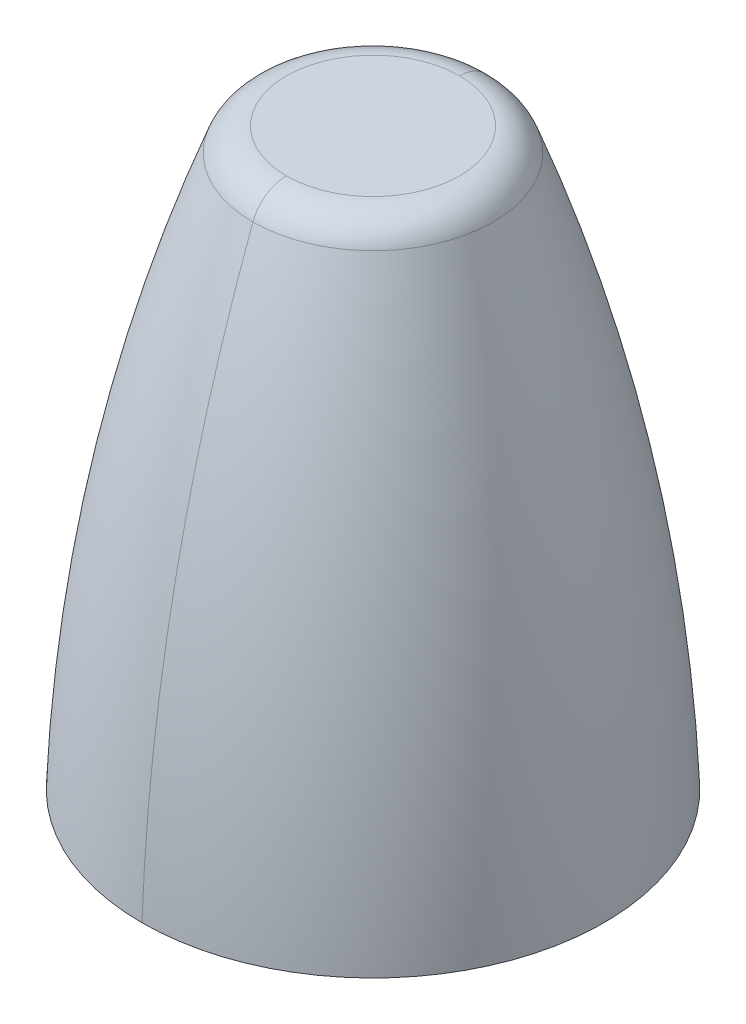
ISO-10303-21;
HEADER;
FILE_DESCRIPTION(('STEP AP214'),'2;1');
FILE_NAME('part.step','',(''),(''),'','','');
FILE_SCHEMA(('AUTOMOTIVE_DESIGN { 1 0 10303 214 1 1 1 1 }'));
ENDSEC;
DATA;
#1=APPLICATION_CONTEXT('core data for automotive mechanical design processes');
#2=APPLICATION_PROTOCOL_DEFINITION('international standard','automotive_design',2000,#1);
#3=PRODUCT_CONTEXT('',#1,'mechanical');
#4=PRODUCT('Part','Part','',(#3));
#5=PRODUCT_RELATED_PRODUCT_CATEGORY('part','',(#4));
#6=PRODUCT_DEFINITION_FORMATION('','',#4);
#7=PRODUCT_DEFINITION_CONTEXT('part definition',#1,'design');
#8=PRODUCT_DEFINITION('design','',#6,#7);
#9=PRODUCT_DEFINITION_SHAPE('','',#8);
#10=(LENGTH_UNIT() NAMED_UNIT(*) SI_UNIT(.MILLI.,.METRE.));
#11=(NAMED_UNIT(*) PLANE_ANGLE_UNIT() SI_UNIT($,.RADIAN.));
#12=(NAMED_UNIT(*) SI_UNIT($,.STERADIAN.) SOLID_ANGLE_UNIT());
#13=UNCERTAINTY_MEASURE_WITH_UNIT(LENGTH_MEASURE(1.E-05),#10,'distance_accuracy_value','');
#14=(GEOMETRIC_REPRESENTATION_CONTEXT(3) GLOBAL_UNCERTAINTY_ASSIGNED_CONTEXT((#13)) GLOBAL_UNIT_ASSIGNED_CONTEXT((#10,
#11,#12)) REPRESENTATION_CONTEXT('',''));
#15=CARTESIAN_POINT('',(0.,0.,0.));
#16=DIRECTION('',(0.,0.,1.));
#17=DIRECTION('',(1.,0.,0.));
#18=AXIS2_PLACEMENT_3D('',#15,#16,#17);
#19=CARTESIAN_POINT('',(0.,5.39961118561913,0.));
#20=DIRECTION('',(0.,-1.,0.));
#21=DIRECTION('',(0.,0.,-1.));
#22=AXIS2_PLACEMENT_3D('',#19,#20,#21);
#23=TOROIDAL_SURFACE('',#22,8.69,2.54);
#24=CARTESIAN_POINT('',(0.,2.85961118561913,0.));
#25=DIRECTION('',(0.,1.,0.));
#26=DIRECTION('',(0.,0.,-1.));
#27=AXIS2_PLACEMENT_3D('',#24,#25,#26);
#28=CIRCLE('',#27,8.69);
#29=CARTESIAN_POINT('',(0.,2.85961118561913,8.69));
#30=VERTEX_POINT('',#29);
#31=CARTESIAN_POINT('',(0.,2.85961118561913,-8.69));
#32=VERTEX_POINT('',#31);
#33=EDGE_CURVE('E40',#30,#32,#28,.T.);
#34=ORIENTED_EDGE('',*,*,#33,.F.);
#35=CARTESIAN_POINT('',(0.,5.39961118561913,8.69));
#36=DIRECTION('',(1.,0.,0.));
#37=DIRECTION('',(0.,0.,-1.));
#38=AXIS2_PLACEMENT_3D('',#35,#36,#37);
#39=CIRCLE('',#38,2.54);
#40=CARTESIAN_POINT('',(0.,5.39961118561913,6.15));
#41=VERTEX_POINT('',#40);
#42=EDGE_CURVE('E10',#30,#41,#39,.T.);
#43=ORIENTED_EDGE('',*,*,#42,.T.);
#44=CARTESIAN_POINT('',(0.,5.39961118561913,0.));
#45=DIRECTION('',(0.,-1.,0.));
#46=DIRECTION('',(0.,0.,-1.));
#47=AXIS2_PLACEMENT_3D('',#44,#45,#46);
#48=CIRCLE('',#47,6.15);
#49=CARTESIAN_POINT('',(0.,5.39961118561913,-6.15));
#50=VERTEX_POINT('',#49);
#51=EDGE_CURVE('E267',#50,#41,#48,.T.);
#52=ORIENTED_EDGE('',*,*,#51,.F.);
#53=CARTESIAN_POINT('',(0.,5.39961118561913,-8.69));
#54=DIRECTION('',(-1.,0.,0.));
#55=DIRECTION('',(0.,0.,1.));
#56=AXIS2_PLACEMENT_3D('',#53,#54,#55);
#57=CIRCLE('',#56,2.54);
#58=EDGE_CURVE('E171',#32,#50,#57,.T.);
#59=ORIENTED_EDGE('',*,*,#58,.F.);
#60=EDGE_LOOP('',(#34,#43,#52,#59));
#61=FACE_BOUND('',#60,.T.);
#62=ADVANCED_FACE('F15',(#61),#23,.T.);
#63=CARTESIAN_POINT('',(0.,31.4346111856192,0.));
#64=DIRECTION('',(0.,-1.,0.));
#65=DIRECTION('',(0.,0.,-1.));
#66=AXIS2_PLACEMENT_3D('',#63,#64,#65);
#67=CONICAL_SURFACE('',#66,5.1308,0.259607300018462);
#68=CARTESIAN_POINT('',(0.,31.4346111856192,0.));
#69=DIRECTION('',(0.,-1.,0.));
#70=DIRECTION('',(0.,0.,-1.));
#71=AXIS2_PLACEMENT_3D('',#68,#69,#70);
#72=CIRCLE('',#71,5.1308);
#73=CARTESIAN_POINT('',(0.,31.4346111856192,5.1308));
#74=VERTEX_POINT('',#73);
#75=CARTESIAN_POINT('',(0.,31.4346111856192,-5.1308));
#76=VERTEX_POINT('',#75);
#77=EDGE_CURVE('E162',#74,#76,#72,.T.);
#78=ORIENTED_EDGE('',*,*,#77,.F.);
#79=DIRECTION('',(0.,-0.966490859144819,0.25670103075272));
#80=VECTOR('',#79,1.);
#81=CARTESIAN_POINT('',(0.,31.4346111856192,5.1308));
#82=LINE('',#81,#80);
#83=CARTESIAN_POINT('',(0.,25.4097866328368,6.731));
#84=VERTEX_POINT('',#83);
#85=EDGE_CURVE('E26',#74,#84,#82,.T.);
#86=ORIENTED_EDGE('',*,*,#85,.T.);
#87=CARTESIAN_POINT('',(0.,25.4097866328368,0.));
#88=DIRECTION('',(0.,-1.,0.));
#89=DIRECTION('',(0.,0.,-1.));
#90=AXIS2_PLACEMENT_3D('',#87,#88,#89);
#91=CIRCLE('',#90,6.731);
#92=CARTESIAN_POINT('',(0.,25.4097866328368,-6.731));
#93=VERTEX_POINT('',#92);
#94=EDGE_CURVE('E151',#84,#93,#91,.T.);
#95=ORIENTED_EDGE('',*,*,#94,.T.);
#96=DIRECTION('',(0.,-0.966490859144819,-0.25670103075272));
#97=VECTOR('',#96,1.);
#98=CARTESIAN_POINT('',(0.,31.4346111856192,-5.1308));
#99=LINE('',#98,#97);
#100=EDGE_CURVE('E169',#76,#93,#99,.T.);
#101=ORIENTED_EDGE('',*,*,#100,.F.);
#102=EDGE_LOOP('',(#78,#86,#95,#101));
#103=FACE_BOUND('',#102,.T.);
#104=ADVANCED_FACE('F160',(#103),#67,.F.);
#105=CARTESIAN_POINT('',(0.,33.,0.));
#106=DIRECTION('',(0.,-1.,0.));
#107=DIRECTION('',(0.,0.,-1.));
#108=AXIS2_PLACEMENT_3D('',#105,#106,#107);
#109=TOROIDAL_SURFACE('',#108,4.84602357836034,2.);
#110=CARTESIAN_POINT('',(0.,35.,0.));
#111=DIRECTION('',(0.,-1.,0.));
#112=DIRECTION('',(0.,0.,-1.));
#113=AXIS2_PLACEMENT_3D('',#110,#111,#112);
#114=CIRCLE('',#113,4.84602357836034);
#115=CARTESIAN_POINT('',(0.,35.,-4.84602357836034));
#116=VERTEX_POINT('',#115);
#117=CARTESIAN_POINT('',(0.,35.,4.84602357836034));
#118=VERTEX_POINT('',#117);
#119=EDGE_CURVE('E157',#116,#118,#114,.T.);
#120=ORIENTED_EDGE('',*,*,#119,.T.);
#121=CARTESIAN_POINT('',(0.,33.,4.84602357836034));
#122=DIRECTION('',(1.,0.,0.));
#123=DIRECTION('',(0.,0.,-1.));
#124=AXIS2_PLACEMENT_3D('',#121,#122,#123);
#125=CIRCLE('',#124,2.);
#126=CARTESIAN_POINT('',(0.,33.7010309278351,6.71913746657395));
#127=VERTEX_POINT('',#126);
#128=EDGE_CURVE('E191',#118,#127,#125,.T.);
#129=ORIENTED_EDGE('',*,*,#128,.T.);
#130=CARTESIAN_POINT('',(0.,33.7010309278351,0.));
#131=DIRECTION('',(0.,-1.,0.));
#132=DIRECTION('',(0.,0.,-1.));
#133=AXIS2_PLACEMENT_3D('',#130,#131,#132);
#134=CIRCLE('',#133,6.71913746657395);
#135=CARTESIAN_POINT('',(0.,33.7010309278351,-6.71913746657395));
#136=VERTEX_POINT('',#135);
#137=EDGE_CURVE('E187',#136,#127,#134,.T.);
#138=ORIENTED_EDGE('',*,*,#137,.F.);
#139=CARTESIAN_POINT('',(0.,33.,-4.84602357836034));
#140=DIRECTION('',(-1.,0.,0.));
#141=DIRECTION('',(0.,0.,1.));
#142=AXIS2_PLACEMENT_3D('',#139,#140,#141);
#143=CIRCLE('',#142,2.);
#144=EDGE_CURVE('E247',#116,#136,#143,.T.);
#145=ORIENTED_EDGE('',*,*,#144,.F.);
#146=EDGE_LOOP('',(#120,#129,#138,#145));
#147=FACE_BOUND('',#146,.T.);
#148=ADVANCED_FACE('F519',(#147),#109,.T.);
#149=CARTESIAN_POINT('',(0.,-1.,0.));
#150=DIRECTION('',(0.,-1.,0.));
#151=DIRECTION('',(0.,0.,1.));
#152=AXIS2_PLACEMENT_3D('',#149,#150,#151);
#153=DEGENERATE_TOROIDAL_SURFACE('',#152,86.,99.,.F.);
#154=ORIENTED_EDGE('',*,*,#137,.T.);
#155=CARTESIAN_POINT('',(0.,-1.,-86.));
#156=DIRECTION('',(1.,0.,0.));
#157=DIRECTION('',(0.,0.,-1.));
#158=AXIS2_PLACEMENT_3D('',#155,#156,#157);
#159=CIRCLE('',#158,99.);
#160=CARTESIAN_POINT('',(0.,2.85961118561913,12.9247360446104));
#161=VERTEX_POINT('',#160);
#162=EDGE_CURVE('E192',#127,#161,#159,.T.);
#163=ORIENTED_EDGE('',*,*,#162,.T.);
#164=CARTESIAN_POINT('',(0.,2.85961118561913,0.));
#165=DIRECTION('',(0.,-1.,0.));
#166=DIRECTION('',(0.,0.,-1.));
#167=AXIS2_PLACEMENT_3D('',#164,#165,#166);
#168=CIRCLE('',#167,12.9247360446104);
#169=CARTESIAN_POINT('',(0.,2.85961118561913,-12.9247360446104));
#170=VERTEX_POINT('',#169);
#171=EDGE_CURVE('E243',#170,#161,#168,.T.);
#172=ORIENTED_EDGE('',*,*,#171,.F.);
#173=CARTESIAN_POINT('',(0.,-1.,86.));
#174=DIRECTION('',(-1.,0.,0.));
#175=DIRECTION('',(0.,0.,1.));
#176=AXIS2_PLACEMENT_3D('',#173,#174,#175);
#177=CIRCLE('',#176,99.);
#178=EDGE_CURVE('E229',#136,#170,#177,.T.);
#179=ORIENTED_EDGE('',*,*,#178,.F.);
#180=EDGE_LOOP('',(#154,#163,#172,#179));
#181=FACE_BOUND('',#180,.T.);
#182=ADVANCED_FACE('F508',(#181),#153,.F.);
#183=CARTESIAN_POINT('',(0.,31.0037578537676,0.));
#184=DIRECTION('',(0.,-1.,0.));
#185=DIRECTION('',(0.,0.,-1.));
#186=AXIS2_PLACEMENT_3D('',#183,#184,#185);
#187=CYLINDRICAL_SURFACE('',#186,6.15);
#188=CARTESIAN_POINT('',(0.,9.85961118561913,0.));
#189=DIRECTION('',(0.,-1.,0.));
#190=DIRECTION('',(0.,0.,-1.));
#191=AXIS2_PLACEMENT_3D('',#188,#189,#190);
#192=CIRCLE('',#191,6.15);
#193=CARTESIAN_POINT('',(0.,9.85961118561913,6.15));
#194=VERTEX_POINT('',#193);
#195=CARTESIAN_POINT('',(0.,9.85961118561913,-6.15));
#196=VERTEX_POINT('',#195);
#197=EDGE_CURVE('E202',#194,#196,#192,.T.);
#198=ORIENTED_EDGE('',*,*,#197,.F.);
#199=DIRECTION('',(0.,-1.,0.));
#200=VECTOR('',#199,1.);
#201=CARTESIAN_POINT('',(0.,31.0037578537676,6.15));
#202=LINE('',#201,#200);
#203=EDGE_CURVE('E237',#194,#41,#202,.T.);
#204=ORIENTED_EDGE('',*,*,#203,.T.);
#205=CARTESIAN_POINT('',(0.,5.39961118561913,0.));
#206=DIRECTION('',(0.,-1.,0.));
#207=DIRECTION('',(0.,0.,-1.));
#208=AXIS2_PLACEMENT_3D('',#205,#206,#207);
#209=CIRCLE('',#208,6.15);
#210=EDGE_CURVE('E217',#41,#50,#209,.T.);
#211=ORIENTED_EDGE('',*,*,#210,.T.);
#212=DIRECTION('',(0.,-1.,0.));
#213=VECTOR('',#212,1.);
#214=CARTESIAN_POINT('',(0.,31.0037578537676,-6.15));
#215=LINE('',#214,#213);
#216=EDGE_CURVE('E207',#196,#50,#215,.T.);
#217=ORIENTED_EDGE('',*,*,#216,.F.);
#218=EDGE_LOOP('',(#198,#204,#211,#217));
#219=FACE_BOUND('',#218,.T.);
#220=ADVANCED_FACE('F382',(#219),#187,.F.);
#221=CARTESIAN_POINT('',(0.,31.0037578537676,0.));
#222=DIRECTION('',(0.,-1.,0.));
#223=DIRECTION('',(0.,0.,-1.));
#224=AXIS2_PLACEMENT_3D('',#221,#222,#223);
#225=CYLINDRICAL_SURFACE('',#224,9.779);
#226=CARTESIAN_POINT('',(0.,13.7722628656191,0.));
#227=DIRECTION('',(0.,-1.,0.));
#228=DIRECTION('',(0.,0.,-1.));
#229=AXIS2_PLACEMENT_3D('',#226,#227,#228);
#230=CIRCLE('',#229,9.779);
#231=CARTESIAN_POINT('',(0.,13.7722628656191,9.779));
#232=VERTEX_POINT('',#231);
#233=CARTESIAN_POINT('',(0.,13.7722628656191,-9.779));
#234=VERTEX_POINT('',#233);
#235=EDGE_CURVE('E251',#232,#234,#230,.T.);
#236=ORIENTED_EDGE('',*,*,#235,.F.);
#237=DIRECTION('',(0.,-1.,0.));
#238=VECTOR('',#237,1.);
#239=CARTESIAN_POINT('',(0.,31.0037578537676,9.779));
#240=LINE('',#239,#238);
#241=CARTESIAN_POINT('',(0.,9.85961118561913,9.779));
#242=VERTEX_POINT('',#241);
#243=EDGE_CURVE('E212',#232,#242,#240,.T.);
#244=ORIENTED_EDGE('',*,*,#243,.T.);
#245=CARTESIAN_POINT('',(0.,9.85961118561913,0.));
#246=DIRECTION('',(0.,-1.,0.));
#247=DIRECTION('',(0.,0.,-1.));
#248=AXIS2_PLACEMENT_3D('',#245,#246,#247);
#249=CIRCLE('',#248,9.779);
#250=CARTESIAN_POINT('',(0.,9.85961118561913,-9.779));
#251=VERTEX_POINT('',#250);
#252=EDGE_CURVE('E208',#242,#251,#249,.T.);
#253=ORIENTED_EDGE('',*,*,#252,.T.);
#254=DIRECTION('',(0.,-1.,0.));
#255=VECTOR('',#254,1.);
#256=CARTESIAN_POINT('',(0.,31.0037578537676,-9.779));
#257=LINE('',#256,#255);
#258=EDGE_CURVE('E224',#234,#251,#257,.T.);
#259=ORIENTED_EDGE('',*,*,#258,.F.);
#260=EDGE_LOOP('',(#236,#244,#253,#259));
#261=FACE_BOUND('',#260,.T.);
#262=ADVANCED_FACE('F17',(#261),#225,.F.);
#263=CARTESIAN_POINT('',(0.,13.7722628656191,0.));
#264=DIRECTION('',(0.,-1.,0.));
#265=DIRECTION('',(0.,0.,-1.));
#266=AXIS2_PLACEMENT_3D('',#263,#264,#265);
#267=TOROIDAL_SURFACE('',#266,7.779,2.);
#268=CARTESIAN_POINT('',(0.,15.7722628656192,0.));
#269=DIRECTION('',(0.,-1.,0.));
#270=DIRECTION('',(0.,0.,-1.));
#271=AXIS2_PLACEMENT_3D('',#268,#269,#270);
#272=CIRCLE('',#271,7.779);
#273=CARTESIAN_POINT('',(0.,15.7722628656192,7.779));
#274=VERTEX_POINT('',#273);
#275=CARTESIAN_POINT('',(0.,15.7722628656192,-7.779));
#276=VERTEX_POINT('',#275);
#277=EDGE_CURVE('E309',#274,#276,#272,.T.);
#278=ORIENTED_EDGE('',*,*,#277,.F.);
#279=CARTESIAN_POINT('',(0.,13.7722628656191,7.779));
#280=DIRECTION('',(1.,0.,0.));
#281=DIRECTION('',(0.,0.,-1.));
#282=AXIS2_PLACEMENT_3D('',#279,#280,#281);
#283=CIRCLE('',#282,2.);
#284=EDGE_CURVE('E213',#274,#232,#283,.T.);
#285=ORIENTED_EDGE('',*,*,#284,.T.);
#286=ORIENTED_EDGE('',*,*,#235,.T.);
#287=CARTESIAN_POINT('',(0.,13.7722628656191,-7.779));
#288=DIRECTION('',(-1.,0.,0.));
#289=DIRECTION('',(0.,0.,1.));
#290=AXIS2_PLACEMENT_3D('',#287,#288,#289);
#291=CIRCLE('',#290,2.);
#292=EDGE_CURVE('E19',#276,#234,#291,.T.);
#293=ORIENTED_EDGE('',*,*,#292,.F.);
#294=EDGE_LOOP('',(#278,#285,#286,#293));
#295=FACE_BOUND('',#294,.T.);
#296=ADVANCED_FACE('F381',(#295),#267,.F.);
#297=CARTESIAN_POINT('',(0.,31.0037578537676,0.));
#298=DIRECTION('',(0.,-1.,0.));
#299=DIRECTION('',(0.,0.,-1.));
#300=AXIS2_PLACEMENT_3D('',#297,#298,#299);
#301=CYLINDRICAL_SURFACE('',#300,5.175);
#302=CARTESIAN_POINT('',(0.,24.3246111856192,0.));
#303=DIRECTION('',(0.,-1.,0.));
#304=DIRECTION('',(0.,0.,-1.));
#305=AXIS2_PLACEMENT_3D('',#302,#303,#304);
#306=CIRCLE('',#305,5.175);
#307=CARTESIAN_POINT('',(0.,24.3246111856192,5.175));
#308=VERTEX_POINT('',#307);
#309=CARTESIAN_POINT('',(0.,24.3246111856192,-5.175));
#310=VERTEX_POINT('',#309);
#311=EDGE_CURVE('E261',#308,#310,#306,.T.);
#312=ORIENTED_EDGE('',*,*,#311,.F.);
#313=DIRECTION('',(0.,-1.,0.));
#314=VECTOR('',#313,1.);
#315=CARTESIAN_POINT('',(0.,31.0037578537676,5.175));
#316=LINE('',#315,#314);
#317=CARTESIAN_POINT('',(0.,15.7722628656192,5.175));
#318=VERTEX_POINT('',#317);
#319=EDGE_CURVE('E255',#308,#318,#316,.T.);
#320=ORIENTED_EDGE('',*,*,#319,.T.);
#321=CARTESIAN_POINT('',(0.,15.7722628656192,0.));
#322=DIRECTION('',(0.,-1.,0.));
#323=DIRECTION('',(0.,0.,-1.));
#324=AXIS2_PLACEMENT_3D('',#321,#322,#323);
#325=CIRCLE('',#324,5.175);
#326=CARTESIAN_POINT('',(0.,15.7722628656192,-5.175));
#327=VERTEX_POINT('',#326);
#328=EDGE_CURVE('E272',#318,#327,#325,.T.);
#329=ORIENTED_EDGE('',*,*,#328,.T.);
#330=DIRECTION('',(0.,-1.,0.));
#331=VECTOR('',#330,1.);
#332=CARTESIAN_POINT('',(0.,31.0037578537676,-5.175));
#333=LINE('',#332,#331);
#334=EDGE_CURVE('E259',#310,#327,#333,.T.);
#335=ORIENTED_EDGE('',*,*,#334,.F.);
#336=EDGE_LOOP('',(#312,#320,#329,#335));
#337=FACE_BOUND('',#336,.T.);
#338=ADVANCED_FACE('F420',(#337),#301,.F.);
#339=CARTESIAN_POINT('',(0.,24.8249911856192,0.));
#340=DIRECTION('',(0.,-1.,0.));
#341=DIRECTION('',(0.,0.,-1.));
#342=AXIS2_PLACEMENT_3D('',#339,#340,#341);
#343=TOROIDAL_SURFACE('',#342,6.23062,0.50038);
#344=CARTESIAN_POINT('',(0.,24.8249911856192,0.));
#345=DIRECTION('',(0.,-1.,0.));
#346=DIRECTION('',(0.,0.,-1.));
#347=AXIS2_PLACEMENT_3D('',#344,#345,#346);
#348=CIRCLE('',#347,6.731);
#349=CARTESIAN_POINT('',(0.,24.8249911856192,6.731));
#350=VERTEX_POINT('',#349);
#351=CARTESIAN_POINT('',(0.,24.8249911856192,-6.731));
#352=VERTEX_POINT('',#351);
#353=EDGE_CURVE('E147',#350,#352,#348,.T.);
#354=ORIENTED_EDGE('',*,*,#353,.F.);
#355=CARTESIAN_POINT('',(0.,24.8249911856192,6.23062));
#356=DIRECTION('',(1.,0.,0.));
#357=DIRECTION('',(0.,0.,-1.));
#358=AXIS2_PLACEMENT_3D('',#355,#356,#357);
#359=CIRCLE('',#358,0.50038);
#360=CARTESIAN_POINT('',(0.,24.3246111856192,6.23062));
#361=VERTEX_POINT('',#360);
#362=EDGE_CURVE('E268',#350,#361,#359,.T.);
#363=ORIENTED_EDGE('',*,*,#362,.T.);
#364=CARTESIAN_POINT('',(0.,24.3246111856192,0.));
#365=DIRECTION('',(0.,-1.,0.));
#366=DIRECTION('',(0.,0.,-1.));
#367=AXIS2_PLACEMENT_3D('',#364,#365,#366);
#368=CIRCLE('',#367,6.23062);
#369=CARTESIAN_POINT('',(0.,24.3246111856192,-6.23062));
#370=VERTEX_POINT('',#369);
#371=EDGE_CURVE('E146',#361,#370,#368,.T.);
#372=ORIENTED_EDGE('',*,*,#371,.T.);
#373=CARTESIAN_POINT('',(0.,24.8249911856192,-6.23062));
#374=DIRECTION('',(-1.,0.,0.));
#375=DIRECTION('',(0.,0.,1.));
#376=AXIS2_PLACEMENT_3D('',#373,#374,#375);
#377=CIRCLE('',#376,0.50038);
#378=EDGE_CURVE('E197',#352,#370,#377,.T.);
#379=ORIENTED_EDGE('',*,*,#378,.F.);
#380=EDGE_LOOP('',(#354,#363,#372,#379));
#381=FACE_BOUND('',#380,.T.);
#382=ADVANCED_FACE('F415',(#381),#343,.F.);
#383=CARTESIAN_POINT('',(0.,31.0037578537676,0.));
#384=DIRECTION('',(0.,-1.,0.));
#385=DIRECTION('',(0.,0.,-1.));
#386=AXIS2_PLACEMENT_3D('',#383,#384,#385);
#387=CYLINDRICAL_SURFACE('',#386,6.731);
#388=ORIENTED_EDGE('',*,*,#94,.F.);
#389=DIRECTION('',(0.,-1.,0.));
#390=VECTOR('',#389,1.);
#391=CARTESIAN_POINT('',(0.,31.0037578537676,6.731));
#392=LINE('',#391,#390);
#393=EDGE_CURVE('E134',#84,#350,#392,.T.);
#394=ORIENTED_EDGE('',*,*,#393,.T.);
#395=ORIENTED_EDGE('',*,*,#353,.T.);
#396=DIRECTION('',(0.,-1.,0.));
#397=VECTOR('',#396,1.);
#398=CARTESIAN_POINT('',(0.,31.0037578537676,-6.731));
#399=LINE('',#398,#397);
#400=EDGE_CURVE('E154',#93,#352,#399,.T.);
#401=ORIENTED_EDGE('',*,*,#400,.F.);
#402=EDGE_LOOP('',(#388,#394,#395,#401));
#403=FACE_BOUND('',#402,.T.);
#404=ADVANCED_FACE('F153',(#403),#387,.F.);
#405=CARTESIAN_POINT('',(0.,31.0037578537676,0.));
#406=DIRECTION('',(0.,-1.,0.));
#407=DIRECTION('',(0.,0.,-1.));
#408=AXIS2_PLACEMENT_3D('',#405,#406,#407);
#409=CYLINDRICAL_SURFACE('',#408,6.731);
#410=ORIENTED_EDGE('',*,*,#393,.F.);
#411=CARTESIAN_POINT('',(0.,25.4097866328368,0.));
#412=DIRECTION('',(0.,-1.,0.));
#413=DIRECTION('',(0.,0.,-1.));
#414=AXIS2_PLACEMENT_3D('',#411,#412,#413);
#415=CIRCLE('',#414,6.731);
#416=EDGE_CURVE('E139',#93,#84,#415,.T.);
#417=ORIENTED_EDGE('',*,*,#416,.F.);
#418=ORIENTED_EDGE('',*,*,#400,.T.);
#419=CARTESIAN_POINT('',(0.,24.8249911856192,0.));
#420=DIRECTION('',(0.,-1.,0.));
#421=DIRECTION('',(0.,0.,-1.));
#422=AXIS2_PLACEMENT_3D('',#419,#420,#421);
#423=CIRCLE('',#422,6.731);
#424=EDGE_CURVE('E141',#352,#350,#423,.T.);
#425=ORIENTED_EDGE('',*,*,#424,.T.);
#426=EDGE_LOOP('',(#410,#417,#418,#425));
#427=FACE_BOUND('',#426,.T.);
#428=ADVANCED_FACE('F136',(#427),#409,.F.);
#429=CARTESIAN_POINT('',(0.,24.8249911856192,0.));
#430=DIRECTION('',(0.,-1.,0.));
#431=DIRECTION('',(0.,0.,-1.));
#432=AXIS2_PLACEMENT_3D('',#429,#430,#431);
#433=TOROIDAL_SURFACE('',#432,6.23062,0.50038);
#434=ORIENTED_EDGE('',*,*,#362,.F.);
#435=ORIENTED_EDGE('',*,*,#424,.F.);
#436=ORIENTED_EDGE('',*,*,#378,.T.);
#437=CARTESIAN_POINT('',(0.,24.3246111856192,0.));
#438=DIRECTION('',(0.,-1.,0.));
#439=DIRECTION('',(0.,0.,-1.));
#440=AXIS2_PLACEMENT_3D('',#437,#438,#439);
#441=CIRCLE('',#440,6.23062);
#442=EDGE_CURVE('E193',#370,#361,#441,.T.);
#443=ORIENTED_EDGE('',*,*,#442,.T.);
#444=EDGE_LOOP('',(#434,#435,#436,#443));
#445=FACE_BOUND('',#444,.T.);
#446=ADVANCED_FACE('F489',(#445),#433,.F.);
#447=CARTESIAN_POINT('',(0.,24.3246111856192,0.));
#448=DIRECTION('',(0.,1.,0.));
#449=DIRECTION('',(1.,0.,0.));
#450=AXIS2_PLACEMENT_3D('',#447,#448,#449);
#451=PLANE('',#450);
#452=ORIENTED_EDGE('',*,*,#442,.F.);
#453=ORIENTED_EDGE('',*,*,#371,.F.);
#454=EDGE_LOOP('',(#452,#453));
#455=FACE_BOUND('',#454,.T.);
#456=CARTESIAN_POINT('',(0.,24.3246111856192,0.));
#457=DIRECTION('',(0.,-1.,0.));
#458=DIRECTION('',(0.,0.,-1.));
#459=AXIS2_PLACEMENT_3D('',#456,#457,#458);
#460=CIRCLE('',#459,5.175);
#461=EDGE_CURVE('E198',#310,#308,#460,.T.);
#462=ORIENTED_EDGE('',*,*,#461,.T.);
#463=ORIENTED_EDGE('',*,*,#311,.T.);
#464=EDGE_LOOP('',(#462,#463));
#465=FACE_BOUND('',#464,.T.);
#466=ADVANCED_FACE('F454',(#455,#465),#451,.T.);
#467=CARTESIAN_POINT('',(0.,31.0037578537676,0.));
#468=DIRECTION('',(0.,-1.,0.));
#469=DIRECTION('',(0.,0.,-1.));
#470=AXIS2_PLACEMENT_3D('',#467,#468,#469);
#471=CYLINDRICAL_SURFACE('',#470,5.175);
#472=ORIENTED_EDGE('',*,*,#319,.F.);
#473=ORIENTED_EDGE('',*,*,#461,.F.);
#474=ORIENTED_EDGE('',*,*,#334,.T.);
#475=CARTESIAN_POINT('',(0.,15.7722628656192,0.));
#476=DIRECTION('',(0.,-1.,0.));
#477=DIRECTION('',(0.,0.,-1.));
#478=AXIS2_PLACEMENT_3D('',#475,#476,#477);
#479=CIRCLE('',#478,5.175);
#480=EDGE_CURVE('E262',#327,#318,#479,.T.);
#481=ORIENTED_EDGE('',*,*,#480,.T.);
#482=EDGE_LOOP('',(#472,#473,#474,#481));
#483=FACE_BOUND('',#482,.T.);
#484=ADVANCED_FACE('F448',(#483),#471,.F.);
#485=CARTESIAN_POINT('',(0.,15.7722628656192,0.));
#486=DIRECTION('',(0.,-1.,0.));
#487=DIRECTION('',(0.,0.,-1.));
#488=AXIS2_PLACEMENT_3D('',#485,#486,#487);
#489=PLANE('',#488);
#490=CARTESIAN_POINT('',(0.,15.7722628656192,0.));
#491=DIRECTION('',(0.,-1.,0.));
#492=DIRECTION('',(0.,0.,-1.));
#493=AXIS2_PLACEMENT_3D('',#490,#491,#492);
#494=CIRCLE('',#493,7.779);
#495=EDGE_CURVE('E282',#276,#274,#494,.T.);
#496=ORIENTED_EDGE('',*,*,#495,.T.);
#497=ORIENTED_EDGE('',*,*,#277,.T.);
#498=EDGE_LOOP('',(#496,#497));
#499=FACE_BOUND('',#498,.T.);
#500=ORIENTED_EDGE('',*,*,#480,.F.);
#501=ORIENTED_EDGE('',*,*,#328,.F.);
#502=EDGE_LOOP('',(#500,#501));
#503=FACE_BOUND('',#502,.T.);
#504=ADVANCED_FACE('F453',(#499,#503),#489,.T.);
#505=CARTESIAN_POINT('',(0.,13.7722628656191,0.));
#506=DIRECTION('',(0.,-1.,0.));
#507=DIRECTION('',(0.,0.,-1.));
#508=AXIS2_PLACEMENT_3D('',#505,#506,#507);
#509=TOROIDAL_SURFACE('',#508,7.779,2.);
#510=ORIENTED_EDGE('',*,*,#284,.F.);
#511=ORIENTED_EDGE('',*,*,#495,.F.);
#512=ORIENTED_EDGE('',*,*,#292,.T.);
#513=CARTESIAN_POINT('',(0.,13.7722628656191,0.));
#514=DIRECTION('',(0.,-1.,0.));
#515=DIRECTION('',(0.,0.,-1.));
#516=AXIS2_PLACEMENT_3D('',#513,#514,#515);
#517=CIRCLE('',#516,9.779);
#518=EDGE_CURVE('E233',#234,#232,#517,.T.);
#519=ORIENTED_EDGE('',*,*,#518,.T.);
#520=EDGE_LOOP('',(#510,#511,#512,#519));
#521=FACE_BOUND('',#520,.T.);
#522=ADVANCED_FACE('F407',(#521),#509,.F.);
#523=CARTESIAN_POINT('',(0.,31.0037578537676,0.));
#524=DIRECTION('',(0.,-1.,0.));
#525=DIRECTION('',(0.,0.,-1.));
#526=AXIS2_PLACEMENT_3D('',#523,#524,#525);
#527=CYLINDRICAL_SURFACE('',#526,9.779);
#528=ORIENTED_EDGE('',*,*,#243,.F.);
#529=ORIENTED_EDGE('',*,*,#518,.F.);
#530=ORIENTED_EDGE('',*,*,#258,.T.);
#531=CARTESIAN_POINT('',(0.,9.85961118561913,0.));
#532=DIRECTION('',(0.,-1.,0.));
#533=DIRECTION('',(0.,0.,-1.));
#534=AXIS2_PLACEMENT_3D('',#531,#532,#533);
#535=CIRCLE('',#534,9.779);
#536=EDGE_CURVE('E220',#251,#242,#535,.T.);
#537=ORIENTED_EDGE('',*,*,#536,.T.);
#538=EDGE_LOOP('',(#528,#529,#530,#537));
#539=FACE_BOUND('',#538,.T.);
#540=ADVANCED_FACE('F396',(#539),#527,.F.);
#541=CARTESIAN_POINT('',(0.,9.85961118561913,0.));
#542=DIRECTION('',(0.,-1.,0.));
#543=DIRECTION('',(0.,0.,-1.));
#544=AXIS2_PLACEMENT_3D('',#541,#542,#543);
#545=PLANE('',#544);
#546=ORIENTED_EDGE('',*,*,#536,.F.);
#547=ORIENTED_EDGE('',*,*,#252,.F.);
#548=EDGE_LOOP('',(#546,#547));
#549=FACE_BOUND('',#548,.T.);
#550=CARTESIAN_POINT('',(0.,9.85961118561913,0.));
#551=DIRECTION('',(0.,-1.,0.));
#552=DIRECTION('',(0.,0.,-1.));
#553=AXIS2_PLACEMENT_3D('',#550,#551,#552);
#554=CIRCLE('',#553,6.15);
#555=EDGE_CURVE('E206',#196,#194,#554,.T.);
#556=ORIENTED_EDGE('',*,*,#555,.T.);
#557=ORIENTED_EDGE('',*,*,#197,.T.);
#558=EDGE_LOOP('',(#556,#557));
#559=FACE_BOUND('',#558,.T.);
#560=ADVANCED_FACE('F390',(#549,#559),#545,.F.);
#561=CARTESIAN_POINT('',(0.,31.0037578537676,0.));
#562=DIRECTION('',(0.,-1.,0.));
#563=DIRECTION('',(0.,0.,-1.));
#564=AXIS2_PLACEMENT_3D('',#561,#562,#563);
#565=CYLINDRICAL_SURFACE('',#564,6.15);
#566=ORIENTED_EDGE('',*,*,#203,.F.);
#567=ORIENTED_EDGE('',*,*,#555,.F.);
#568=ORIENTED_EDGE('',*,*,#216,.T.);
#569=ORIENTED_EDGE('',*,*,#51,.T.);
#570=EDGE_LOOP('',(#566,#567,#568,#569));
#571=FACE_BOUND('',#570,.T.);
#572=ADVANCED_FACE('F395',(#571),#565,.F.);
#573=CARTESIAN_POINT('',(0.,2.85961118561913,0.));
#574=DIRECTION('',(0.,-1.,0.));
#575=DIRECTION('',(0.,0.,-1.));
#576=AXIS2_PLACEMENT_3D('',#573,#574,#575);
#577=PLANE('',#576);
#578=ORIENTED_EDGE('',*,*,#171,.T.);
#579=CARTESIAN_POINT('',(0.,2.85961118561913,0.));
#580=DIRECTION('',(0.,-1.,0.));
#581=DIRECTION('',(0.,0.,-1.));
#582=AXIS2_PLACEMENT_3D('',#579,#580,#581);
#583=CIRCLE('',#582,12.9247360446104);
#584=EDGE_CURVE('E186',#161,#170,#583,.T.);
#585=ORIENTED_EDGE('',*,*,#584,.T.);
#586=EDGE_LOOP('',(#578,#585));
#587=FACE_BOUND('',#586,.T.);
#588=CARTESIAN_POINT('',(0.,2.85961118561913,0.));
#589=DIRECTION('',(0.,1.,0.));
#590=DIRECTION('',(0.,0.,-1.));
#591=AXIS2_PLACEMENT_3D('',#588,#589,#590);
#592=CIRCLE('',#591,8.69);
#593=EDGE_CURVE('E182',#32,#30,#592,.T.);
#594=ORIENTED_EDGE('',*,*,#593,.T.);
#595=ORIENTED_EDGE('',*,*,#33,.T.);
#596=EDGE_LOOP('',(#594,#595));
#597=FACE_BOUND('',#596,.T.);
#598=ADVANCED_FACE('F530',(#587,#597),#577,.T.);
#599=CARTESIAN_POINT('',(0.,-1.,0.));
#600=DIRECTION('',(0.,-1.,0.));
#601=DIRECTION('',(0.,0.,1.));
#602=AXIS2_PLACEMENT_3D('',#599,#600,#601);
#603=DEGENERATE_TOROIDAL_SURFACE('',#602,86.,99.,.F.);
#604=ORIENTED_EDGE('',*,*,#162,.F.);
#605=CARTESIAN_POINT('',(0.,33.7010309278351,0.));
#606=DIRECTION('',(0.,-1.,0.));
#607=DIRECTION('',(0.,0.,-1.));
#608=AXIS2_PLACEMENT_3D('',#605,#606,#607);
#609=CIRCLE('',#608,6.71913746657395);
#610=EDGE_CURVE('E225',#127,#136,#609,.T.);
#611=ORIENTED_EDGE('',*,*,#610,.T.);
#612=ORIENTED_EDGE('',*,*,#178,.T.);
#613=ORIENTED_EDGE('',*,*,#584,.F.);
#614=EDGE_LOOP('',(#604,#611,#612,#613));
#615=FACE_BOUND('',#614,.T.);
#616=ADVANCED_FACE('F621',(#615),#603,.F.);
#617=CARTESIAN_POINT('',(0.,33.,0.));
#618=DIRECTION('',(0.,-1.,0.));
#619=DIRECTION('',(0.,0.,-1.));
#620=AXIS2_PLACEMENT_3D('',#617,#618,#619);
#621=TOROIDAL_SURFACE('',#620,4.84602357836034,2.);
#622=ORIENTED_EDGE('',*,*,#128,.F.);
#623=CARTESIAN_POINT('',(0.,35.,0.));
#624=DIRECTION('',(0.,-1.,0.));
#625=DIRECTION('',(0.,0.,-1.));
#626=AXIS2_PLACEMENT_3D('',#623,#624,#625);
#627=CIRCLE('',#626,4.84602357836034);
#628=EDGE_CURVE('E286',#118,#116,#627,.T.);
#629=ORIENTED_EDGE('',*,*,#628,.T.);
#630=ORIENTED_EDGE('',*,*,#144,.T.);
#631=ORIENTED_EDGE('',*,*,#610,.F.);
#632=EDGE_LOOP('',(#622,#629,#630,#631));
#633=FACE_BOUND('',#632,.T.);
#634=ADVANCED_FACE('F324',(#633),#621,.T.);
#635=CARTESIAN_POINT('',(0.,35.,0.));
#636=DIRECTION('',(0.,-1.,0.));
#637=DIRECTION('',(0.,0.,-1.));
#638=AXIS2_PLACEMENT_3D('',#635,#636,#637);
#639=PLANE('',#638);
#640=ORIENTED_EDGE('',*,*,#119,.F.);
#641=ORIENTED_EDGE('',*,*,#628,.F.);
#642=EDGE_LOOP('',(#640,#641));
#643=FACE_BOUND('',#642,.T.);
#644=ADVANCED_FACE('F329',(#643),#639,.F.);
#645=CARTESIAN_POINT('',(0.,31.4346111856192,0.));
#646=DIRECTION('',(0.,-1.,0.));
#647=DIRECTION('',(0.,0.,-1.));
#648=AXIS2_PLACEMENT_3D('',#645,#646,#647);
#649=PLANE('',#648);
#650=CARTESIAN_POINT('',(0.,31.4346111856192,0.));
#651=DIRECTION('',(0.,-1.,0.));
#652=DIRECTION('',(0.,0.,-1.));
#653=AXIS2_PLACEMENT_3D('',#650,#651,#652);
#654=CIRCLE('',#653,5.1308);
#655=EDGE_CURVE('E244',#76,#74,#654,.T.);
#656=ORIENTED_EDGE('',*,*,#655,.T.);
#657=ORIENTED_EDGE('',*,*,#77,.T.);
#658=EDGE_LOOP('',(#656,#657));
#659=FACE_BOUND('',#658,.T.);
#660=ADVANCED_FACE('F468',(#659),#649,.T.);
#661=CARTESIAN_POINT('',(0.,31.4346111856192,0.));
#662=DIRECTION('',(0.,-1.,0.));
#663=DIRECTION('',(0.,0.,-1.));
#664=AXIS2_PLACEMENT_3D('',#661,#662,#663);
#665=CONICAL_SURFACE('',#664,5.1308,0.259607300018462);
#666=ORIENTED_EDGE('',*,*,#85,.F.);
#667=ORIENTED_EDGE('',*,*,#655,.F.);
#668=ORIENTED_EDGE('',*,*,#100,.T.);
#669=ORIENTED_EDGE('',*,*,#416,.T.);
#670=EDGE_LOOP('',(#666,#667,#668,#669));
#671=FACE_BOUND('',#670,.T.);
#672=ADVANCED_FACE('F168',(#671),#665,.F.);
#673=CARTESIAN_POINT('',(0.,5.39961118561913,0.));
#674=DIRECTION('',(0.,-1.,0.));
#675=DIRECTION('',(0.,0.,-1.));
#676=AXIS2_PLACEMENT_3D('',#673,#674,#675);
#677=TOROIDAL_SURFACE('',#676,8.69,2.54);
#678=ORIENTED_EDGE('',*,*,#42,.F.);
#679=ORIENTED_EDGE('',*,*,#593,.F.);
#680=ORIENTED_EDGE('',*,*,#58,.T.);
#681=ORIENTED_EDGE('',*,*,#210,.F.);
#682=EDGE_LOOP('',(#678,#679,#680,#681));
#683=FACE_BOUND('',#682,.T.);
#684=ADVANCED_FACE('F467',(#683),#677,.T.);
#685=CLOSED_SHELL('',(#62,#104,#148,#182,#220,#262,#296,#338,#382,#404,#428,#446,#466,#484,#504,
#522,#540,#560,#572,#598,#616,#634,#644,#660,#672,#684));
#686=MANIFOLD_SOLID_BREP('B1',#685);
#687=ADVANCED_BREP_SHAPE_REPRESENTATION('',(#18,#686),#14);
#688=SHAPE_DEFINITION_REPRESENTATION(#9,#687);
ENDSEC;
END-ISO-10303-21;
